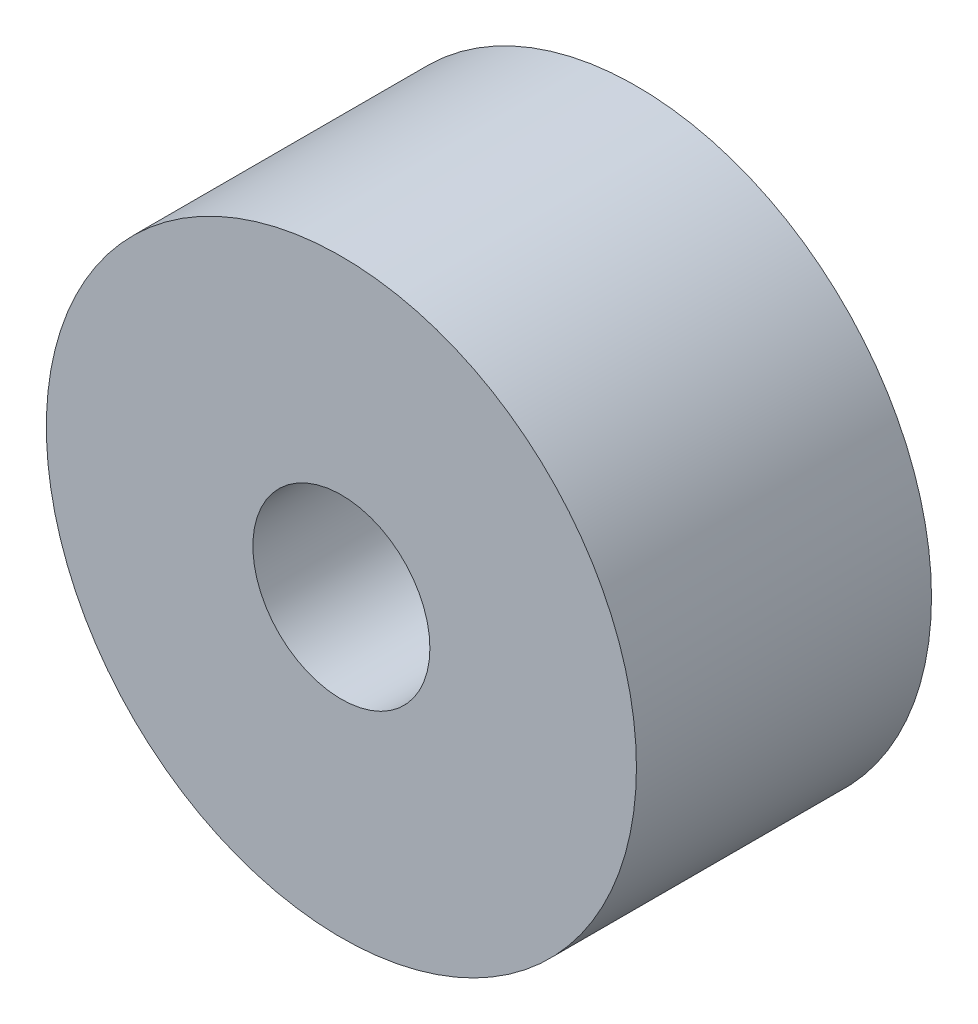
ISO-10303-21;
HEADER;
FILE_DESCRIPTION(('STEP AP214'),'2;1');
FILE_NAME('part.step','',(''),(''),'','','');
FILE_SCHEMA(('AUTOMOTIVE_DESIGN { 1 0 10303 214 1 1 1 1 }'));
ENDSEC;
DATA;
#1=APPLICATION_CONTEXT('core data for automotive mechanical design processes');
#2=APPLICATION_PROTOCOL_DEFINITION('international standard','automotive_design',2000,#1);
#3=PRODUCT_CONTEXT('',#1,'mechanical');
#4=PRODUCT('Part','Part','',(#3));
#5=PRODUCT_RELATED_PRODUCT_CATEGORY('part','',(#4));
#6=PRODUCT_DEFINITION_FORMATION('','',#4);
#7=PRODUCT_DEFINITION_CONTEXT('part definition',#1,'design');
#8=PRODUCT_DEFINITION('design','',#6,#7);
#9=PRODUCT_DEFINITION_SHAPE('','',#8);
#10=(LENGTH_UNIT() NAMED_UNIT(*) SI_UNIT(.MILLI.,.METRE.));
#11=(NAMED_UNIT(*) PLANE_ANGLE_UNIT() SI_UNIT($,.RADIAN.));
#12=(NAMED_UNIT(*) SI_UNIT($,.STERADIAN.) SOLID_ANGLE_UNIT());
#13=UNCERTAINTY_MEASURE_WITH_UNIT(LENGTH_MEASURE(1.E-05),#10,'distance_accuracy_value','');
#14=(GEOMETRIC_REPRESENTATION_CONTEXT(3) GLOBAL_UNCERTAINTY_ASSIGNED_CONTEXT((#13)) GLOBAL_UNIT_ASSIGNED_CONTEXT((#10,
#11,#12)) REPRESENTATION_CONTEXT('',''));
#15=CARTESIAN_POINT('',(0.,0.,0.));
#16=DIRECTION('',(0.,0.,1.));
#17=DIRECTION('',(1.,0.,0.));
#18=AXIS2_PLACEMENT_3D('',#15,#16,#17);
#19=CARTESIAN_POINT('',(0.,0.,10.));
#20=DIRECTION('',(0.,0.,1.));
#21=DIRECTION('',(1.,0.,0.));
#22=AXIS2_PLACEMENT_3D('',#19,#20,#21);
#23=PLANE('',#22);
#24=CARTESIAN_POINT('',(0.,0.,10.));
#25=DIRECTION('',(0.,0.,1.));
#26=DIRECTION('',(1.,0.,0.));
#27=AXIS2_PLACEMENT_3D('',#24,#25,#26);
#28=CIRCLE('',#27,10.);
#29=CARTESIAN_POINT('',(10.,0.,10.));
#30=VERTEX_POINT('',#29);
#31=EDGE_CURVE('E10',#30,#30,#28,.T.);
#32=ORIENTED_EDGE('',*,*,#31,.T.);
#33=EDGE_LOOP('',(#32));
#34=FACE_BOUND('',#33,.T.);
#35=CARTESIAN_POINT('',(0.,0.,10.));
#36=DIRECTION('',(0.,0.,1.));
#37=DIRECTION('',(1.,0.,0.));
#38=AXIS2_PLACEMENT_3D('',#35,#36,#37);
#39=CIRCLE('',#38,3.);
#40=CARTESIAN_POINT('',(3.,0.,10.));
#41=VERTEX_POINT('',#40);
#42=EDGE_CURVE('E42',#41,#41,#39,.T.);
#43=ORIENTED_EDGE('',*,*,#42,.F.);
#44=EDGE_LOOP('',(#43));
#45=FACE_BOUND('',#44,.T.);
#46=ADVANCED_FACE('F31',(#34,#45),#23,.T.);
#47=CARTESIAN_POINT('',(0.,0.,0.));
#48=DIRECTION('',(0.,0.,1.));
#49=DIRECTION('',(1.,0.,0.));
#50=AXIS2_PLACEMENT_3D('',#47,#48,#49);
#51=PLANE('',#50);
#52=CARTESIAN_POINT('',(0.,0.,0.));
#53=DIRECTION('',(0.,0.,1.));
#54=DIRECTION('',(1.,0.,0.));
#55=AXIS2_PLACEMENT_3D('',#52,#53,#54);
#56=CIRCLE('',#55,10.);
#57=CARTESIAN_POINT('',(10.,0.,0.));
#58=VERTEX_POINT('',#57);
#59=EDGE_CURVE('E35',#58,#58,#56,.T.);
#60=ORIENTED_EDGE('',*,*,#59,.F.);
#61=EDGE_LOOP('',(#60));
#62=FACE_BOUND('',#61,.T.);
#63=CARTESIAN_POINT('',(0.,0.,0.));
#64=DIRECTION('',(0.,0.,1.));
#65=DIRECTION('',(1.,0.,0.));
#66=AXIS2_PLACEMENT_3D('',#63,#64,#65);
#67=CIRCLE('',#66,3.);
#68=CARTESIAN_POINT('',(3.,0.,0.));
#69=VERTEX_POINT('',#68);
#70=EDGE_CURVE('E44',#69,#69,#67,.T.);
#71=ORIENTED_EDGE('',*,*,#70,.T.);
#72=EDGE_LOOP('',(#71));
#73=FACE_BOUND('',#72,.T.);
#74=ADVANCED_FACE('F54',(#62,#73),#51,.F.);
#75=CARTESIAN_POINT('',(0.,0.,10.));
#76=DIRECTION('',(0.,0.,-1.));
#77=DIRECTION('',(-1.,0.,0.));
#78=AXIS2_PLACEMENT_3D('',#75,#76,#77);
#79=CYLINDRICAL_SURFACE('',#78,10.);
#80=ORIENTED_EDGE('',*,*,#31,.F.);
#81=EDGE_LOOP('',(#80));
#82=FACE_BOUND('',#81,.T.);
#83=ORIENTED_EDGE('',*,*,#59,.T.);
#84=EDGE_LOOP('',(#83));
#85=FACE_BOUND('',#84,.T.);
#86=ADVANCED_FACE('F33',(#82,#85),#79,.T.);
#87=CARTESIAN_POINT('',(0.,0.,10.));
#88=DIRECTION('',(0.,0.,-1.));
#89=DIRECTION('',(-1.,0.,0.));
#90=AXIS2_PLACEMENT_3D('',#87,#88,#89);
#91=CYLINDRICAL_SURFACE('',#90,3.);
#92=ORIENTED_EDGE('',*,*,#42,.T.);
#93=EDGE_LOOP('',(#92));
#94=FACE_BOUND('',#93,.T.);
#95=ORIENTED_EDGE('',*,*,#70,.F.);
#96=EDGE_LOOP('',(#95));
#97=FACE_BOUND('',#96,.T.);
#98=ADVANCED_FACE('F50',(#94,#97),#91,.F.);
#99=CLOSED_SHELL('',(#46,#74,#86,#98));
#100=MANIFOLD_SOLID_BREP('B2',#99);
#101=ADVANCED_BREP_SHAPE_REPRESENTATION('',(#18,#100),#14);
#102=SHAPE_DEFINITION_REPRESENTATION(#9,#101);
ENDSEC;
END-ISO-10303-21;
